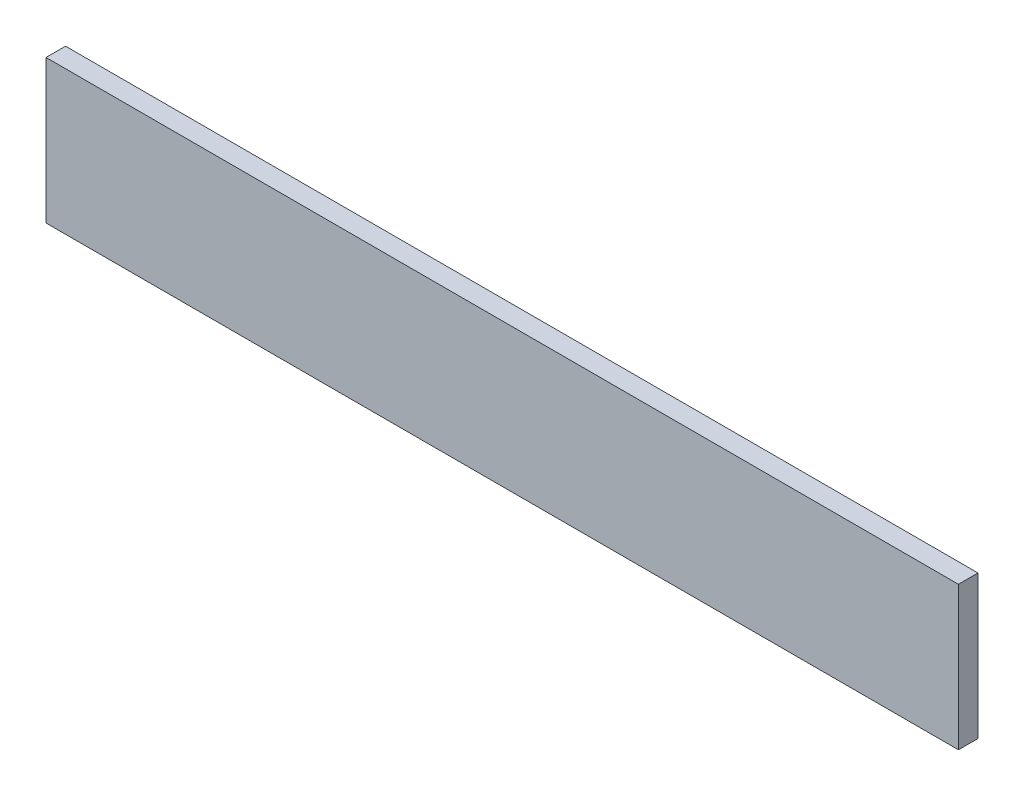
ISO-10303-21;
HEADER;
FILE_DESCRIPTION(('STEP AP214'),'2;1');
FILE_NAME('part.step','',(''),(''),'','','');
FILE_SCHEMA(('AUTOMOTIVE_DESIGN { 1 0 10303 214 1 1 1 1 }'));
ENDSEC;
DATA;
#1=APPLICATION_CONTEXT('core data for automotive mechanical design processes');
#2=APPLICATION_PROTOCOL_DEFINITION('international standard','automotive_design',2000,#1);
#3=PRODUCT_CONTEXT('',#1,'mechanical');
#4=PRODUCT('Part','Part','',(#3));
#5=PRODUCT_RELATED_PRODUCT_CATEGORY('part','',(#4));
#6=PRODUCT_DEFINITION_FORMATION('','',#4);
#7=PRODUCT_DEFINITION_CONTEXT('part definition',#1,'design');
#8=PRODUCT_DEFINITION('design','',#6,#7);
#9=PRODUCT_DEFINITION_SHAPE('','',#8);
#10=(LENGTH_UNIT() NAMED_UNIT(*) SI_UNIT(.MILLI.,.METRE.));
#11=(NAMED_UNIT(*) PLANE_ANGLE_UNIT() SI_UNIT($,.RADIAN.));
#12=(NAMED_UNIT(*) SI_UNIT($,.STERADIAN.) SOLID_ANGLE_UNIT());
#13=UNCERTAINTY_MEASURE_WITH_UNIT(LENGTH_MEASURE(1.E-05),#10,'distance_accuracy_value','');
#14=(GEOMETRIC_REPRESENTATION_CONTEXT(3) GLOBAL_UNCERTAINTY_ASSIGNED_CONTEXT((#13)) GLOBAL_UNIT_ASSIGNED_CONTEXT((#10,
#11,#12)) REPRESENTATION_CONTEXT('',''));
#15=CARTESIAN_POINT('',(0.,0.,0.));
#16=DIRECTION('',(0.,0.,1.));
#17=DIRECTION('',(1.,0.,0.));
#18=AXIS2_PLACEMENT_3D('',#15,#16,#17);
#19=CARTESIAN_POINT('',(0.,0.,19.05));
#20=DIRECTION('',(1.,0.,0.));
#21=DIRECTION('',(0.,0.,-1.));
#22=AXIS2_PLACEMENT_3D('',#19,#20,#21);
#23=PLANE('',#22);
#24=DIRECTION('',(0.,-1.,0.));
#25=VECTOR('',#24,1.);
#26=CARTESIAN_POINT('',(0.,0.,0.));
#27=LINE('',#26,#25);
#28=CARTESIAN_POINT('',(0.,139.7,0.));
#29=VERTEX_POINT('',#28);
#30=CARTESIAN_POINT('',(0.,0.,0.));
#31=VERTEX_POINT('',#30);
#32=EDGE_CURVE('E107',#29,#31,#27,.T.);
#33=ORIENTED_EDGE('',*,*,#32,.T.);
#34=DIRECTION('',(0.,0.,-1.));
#35=VECTOR('',#34,1.);
#36=CARTESIAN_POINT('',(0.,0.,19.05));
#37=LINE('',#36,#35);
#38=CARTESIAN_POINT('',(0.,0.,19.05));
#39=VERTEX_POINT('',#38);
#40=EDGE_CURVE('E11',#39,#31,#37,.T.);
#41=ORIENTED_EDGE('',*,*,#40,.F.);
#42=DIRECTION('',(0.,-1.,0.));
#43=VECTOR('',#42,1.);
#44=CARTESIAN_POINT('',(0.,0.,19.05));
#45=LINE('',#44,#43);
#46=CARTESIAN_POINT('',(0.,139.7,19.05));
#47=VERTEX_POINT('',#46);
#48=EDGE_CURVE('E91',#47,#39,#45,.T.);
#49=ORIENTED_EDGE('',*,*,#48,.F.);
#50=DIRECTION('',(0.,0.,-1.));
#51=VECTOR('',#50,1.);
#52=CARTESIAN_POINT('',(0.,139.7,19.05));
#53=LINE('',#52,#51);
#54=EDGE_CURVE('E103',#47,#29,#53,.T.);
#55=ORIENTED_EDGE('',*,*,#54,.T.);
#56=EDGE_LOOP('',(#33,#41,#49,#55));
#57=FACE_BOUND('',#56,.T.);
#58=ADVANCED_FACE('F39',(#57),#23,.F.);
#59=CARTESIAN_POINT('',(0.,0.,19.05));
#60=DIRECTION('',(0.,1.,0.));
#61=DIRECTION('',(0.,0.,1.));
#62=AXIS2_PLACEMENT_3D('',#59,#60,#61);
#63=PLANE('',#62);
#64=DIRECTION('',(1.,0.,0.));
#65=VECTOR('',#64,1.);
#66=CARTESIAN_POINT('',(0.,0.,0.));
#67=LINE('',#66,#65);
#68=CARTESIAN_POINT('',(889.,0.,0.));
#69=VERTEX_POINT('',#68);
#70=EDGE_CURVE('E96',#31,#69,#67,.T.);
#71=ORIENTED_EDGE('',*,*,#70,.T.);
#72=DIRECTION('',(0.,0.,-1.));
#73=VECTOR('',#72,1.);
#74=CARTESIAN_POINT('',(889.,0.,19.05));
#75=LINE('',#74,#73);
#76=CARTESIAN_POINT('',(889.,0.,19.05));
#77=VERTEX_POINT('',#76);
#78=EDGE_CURVE('E48',#77,#69,#75,.T.);
#79=ORIENTED_EDGE('',*,*,#78,.F.);
#80=DIRECTION('',(1.,0.,0.));
#81=VECTOR('',#80,1.);
#82=CARTESIAN_POINT('',(0.,0.,19.05));
#83=LINE('',#82,#81);
#84=EDGE_CURVE('E86',#39,#77,#83,.T.);
#85=ORIENTED_EDGE('',*,*,#84,.F.);
#86=ORIENTED_EDGE('',*,*,#40,.T.);
#87=EDGE_LOOP('',(#71,#79,#85,#86));
#88=FACE_BOUND('',#87,.T.);
#89=ADVANCED_FACE('F95',(#88),#63,.F.);
#90=CARTESIAN_POINT('',(889.,0.,19.05));
#91=DIRECTION('',(-1.,0.,0.));
#92=DIRECTION('',(0.,0.,1.));
#93=AXIS2_PLACEMENT_3D('',#90,#91,#92);
#94=PLANE('',#93);
#95=DIRECTION('',(0.,1.,0.));
#96=VECTOR('',#95,1.);
#97=CARTESIAN_POINT('',(889.,0.,0.));
#98=LINE('',#97,#96);
#99=CARTESIAN_POINT('',(889.,139.7,0.));
#100=VERTEX_POINT('',#99);
#101=EDGE_CURVE('E73',#69,#100,#98,.T.);
#102=ORIENTED_EDGE('',*,*,#101,.T.);
#103=DIRECTION('',(0.,0.,-1.));
#104=VECTOR('',#103,1.);
#105=CARTESIAN_POINT('',(889.,139.7,19.05));
#106=LINE('',#105,#104);
#107=CARTESIAN_POINT('',(889.,139.7,19.05));
#108=VERTEX_POINT('',#107);
#109=EDGE_CURVE('E98',#108,#100,#106,.T.);
#110=ORIENTED_EDGE('',*,*,#109,.F.);
#111=DIRECTION('',(0.,1.,0.));
#112=VECTOR('',#111,1.);
#113=CARTESIAN_POINT('',(889.,0.,19.05));
#114=LINE('',#113,#112);
#115=EDGE_CURVE('E89',#77,#108,#114,.T.);
#116=ORIENTED_EDGE('',*,*,#115,.F.);
#117=ORIENTED_EDGE('',*,*,#78,.T.);
#118=EDGE_LOOP('',(#102,#110,#116,#117));
#119=FACE_BOUND('',#118,.T.);
#120=ADVANCED_FACE('F99',(#119),#94,.F.);
#121=CARTESIAN_POINT('',(0.,139.7,19.05));
#122=DIRECTION('',(0.,-1.,0.));
#123=DIRECTION('',(0.,0.,-1.));
#124=AXIS2_PLACEMENT_3D('',#121,#122,#123);
#125=PLANE('',#124);
#126=DIRECTION('',(-1.,0.,0.));
#127=VECTOR('',#126,1.);
#128=CARTESIAN_POINT('',(0.,139.7,0.));
#129=LINE('',#128,#127);
#130=EDGE_CURVE('E79',#100,#29,#129,.T.);
#131=ORIENTED_EDGE('',*,*,#130,.T.);
#132=ORIENTED_EDGE('',*,*,#54,.F.);
#133=DIRECTION('',(-1.,0.,0.));
#134=VECTOR('',#133,1.);
#135=CARTESIAN_POINT('',(0.,139.7,19.05));
#136=LINE('',#135,#134);
#137=EDGE_CURVE('E56',#108,#47,#136,.T.);
#138=ORIENTED_EDGE('',*,*,#137,.F.);
#139=ORIENTED_EDGE('',*,*,#109,.T.);
#140=EDGE_LOOP('',(#131,#132,#138,#139));
#141=FACE_BOUND('',#140,.T.);
#142=ADVANCED_FACE('F120',(#141),#125,.F.);
#143=CARTESIAN_POINT('',(0.,0.,19.05));
#144=DIRECTION('',(0.,0.,-1.));
#145=DIRECTION('',(-1.,0.,0.));
#146=AXIS2_PLACEMENT_3D('',#143,#144,#145);
#147=PLANE('',#146);
#148=ORIENTED_EDGE('',*,*,#48,.T.);
#149=ORIENTED_EDGE('',*,*,#84,.T.);
#150=ORIENTED_EDGE('',*,*,#115,.T.);
#151=ORIENTED_EDGE('',*,*,#137,.T.);
#152=EDGE_LOOP('',(#148,#149,#150,#151));
#153=FACE_BOUND('',#152,.T.);
#154=ADVANCED_FACE('F87',(#153),#147,.F.);
#155=CARTESIAN_POINT('',(0.,0.,0.));
#156=DIRECTION('',(0.,0.,-1.));
#157=DIRECTION('',(-1.,0.,0.));
#158=AXIS2_PLACEMENT_3D('',#155,#156,#157);
#159=PLANE('',#158);
#160=ORIENTED_EDGE('',*,*,#32,.F.);
#161=ORIENTED_EDGE('',*,*,#130,.F.);
#162=ORIENTED_EDGE('',*,*,#101,.F.);
#163=ORIENTED_EDGE('',*,*,#70,.F.);
#164=EDGE_LOOP('',(#160,#161,#162,#163));
#165=FACE_BOUND('',#164,.T.);
#166=ADVANCED_FACE('F123',(#165),#159,.T.);
#167=CLOSED_SHELL('',(#58,#89,#120,#142,#154,#166));
#168=MANIFOLD_SOLID_BREP('B2',#167);
#169=ADVANCED_BREP_SHAPE_REPRESENTATION('',(#18,#168),#14);
#170=SHAPE_DEFINITION_REPRESENTATION(#9,#169);
ENDSEC;
END-ISO-10303-21;
